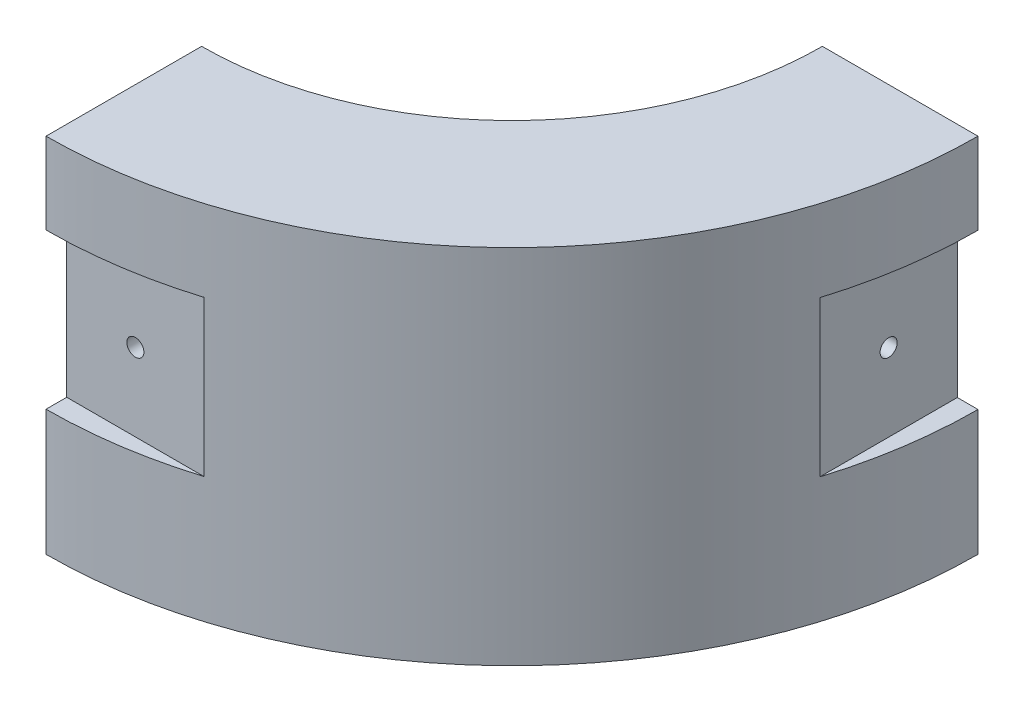
ISO-10303-21;
HEADER;
FILE_DESCRIPTION(('STEP AP214'),'2;1');
FILE_NAME('part.step','',(''),(''),'','','');
FILE_SCHEMA(('AUTOMOTIVE_DESIGN { 1 0 10303 214 1 1 1 1 }'));
ENDSEC;
DATA;
#1=APPLICATION_CONTEXT('core data for automotive mechanical design processes');
#2=APPLICATION_PROTOCOL_DEFINITION('international standard','automotive_design',2000,#1);
#3=PRODUCT_CONTEXT('',#1,'mechanical');
#4=PRODUCT('Part','Part','',(#3));
#5=PRODUCT_RELATED_PRODUCT_CATEGORY('part','',(#4));
#6=PRODUCT_DEFINITION_FORMATION('','',#4);
#7=PRODUCT_DEFINITION_CONTEXT('part definition',#1,'design');
#8=PRODUCT_DEFINITION('design','',#6,#7);
#9=PRODUCT_DEFINITION_SHAPE('','',#8);
#10=(LENGTH_UNIT() NAMED_UNIT(*) SI_UNIT(.MILLI.,.METRE.));
#11=(NAMED_UNIT(*) PLANE_ANGLE_UNIT() SI_UNIT($,.RADIAN.));
#12=(NAMED_UNIT(*) SI_UNIT($,.STERADIAN.) SOLID_ANGLE_UNIT());
#13=UNCERTAINTY_MEASURE_WITH_UNIT(LENGTH_MEASURE(1.E-05),#10,'distance_accuracy_value','');
#14=(GEOMETRIC_REPRESENTATION_CONTEXT(3) GLOBAL_UNCERTAINTY_ASSIGNED_CONTEXT((#13)) GLOBAL_UNIT_ASSIGNED_CONTEXT((#10,
#11,#12)) REPRESENTATION_CONTEXT('',''));
#15=CARTESIAN_POINT('',(0.,0.,0.));
#16=DIRECTION('',(0.,0.,1.));
#17=DIRECTION('',(1.,0.,0.));
#18=AXIS2_PLACEMENT_3D('',#15,#16,#17);
#19=CARTESIAN_POINT('',(0.,8.50000000000001,0.));
#20=DIRECTION('',(0.,1.,0.));
#21=DIRECTION('',(0.,0.,1.));
#22=AXIS2_PLACEMENT_3D('',#19,#20,#21);
#23=CYLINDRICAL_SURFACE('',#22,60.);
#24=CARTESIAN_POINT('',(14.9221512950991,39.294262642486,58.1147950243841));
#25=CARTESIAN_POINT('',(14.9221469227341,39.20366927716,58.1147963415276));
#26=CARTESIAN_POINT('',(14.9146611202311,39.1130088200521,58.1167198726083));
#27=CARTESIAN_POINT('',(14.8849458180313,38.9342275975515,58.1243375314419));
#28=CARTESIAN_POINT('',(14.8626983673999,38.8461100607909,58.1300362500063));
#29=CARTESIAN_POINT('',(14.8042287410592,38.6750745396955,58.1449543367766));
#30=CARTESIAN_POINT('',(14.7680232244369,38.5921504935091,58.1541695079292));
#31=CARTESIAN_POINT('',(14.6828059285463,38.433651738914,58.1757435076237));
#32=CARTESIAN_POINT('',(14.6337964510278,38.3580757129095,58.1881017711258));
#33=CARTESIAN_POINT('',(14.5236516849033,38.2151401531799,58.2156920613692));
#34=CARTESIAN_POINT('',(14.4623497471194,38.1479167477254,58.2309634246752));
#35=CARTESIAN_POINT('',(14.3298804772536,38.0246570988623,58.2637037438709));
#36=CARTESIAN_POINT('',(14.2587114917633,37.9686227342348,58.2811730680244));
#37=CARTESIAN_POINT('',(14.1062845273381,37.8676158198989,58.3182566273485));
#38=CARTESIAN_POINT('',(14.0247930282642,37.8230130942743,58.3379185236071));
#39=CARTESIAN_POINT('',(13.8557171254212,37.7481376120185,58.3783063706649));
#40=CARTESIAN_POINT('',(13.7681318901063,37.7178668155257,58.3990324665822));
#41=CARTESIAN_POINT('',(13.5871392985228,37.6718564292309,58.4414106274242));
#42=CARTESIAN_POINT('',(13.4936437536102,37.6564726065591,58.4630730134987));
#43=CARTESIAN_POINT('',(13.3053527215496,37.6418959913984,58.5062126469877));
#44=CARTESIAN_POINT('',(13.2105571553876,37.6427041874417,58.5276898830186));
#45=CARTESIAN_POINT('',(13.0216334004083,37.6606138688564,58.5700136774354));
#46=CARTESIAN_POINT('',(12.9275151266781,37.6778341853051,58.5908544912301));
#47=CARTESIAN_POINT('',(12.7433918975445,37.7283680196787,58.6311764268283));
#48=CARTESIAN_POINT('',(12.6533868079374,37.7616810121256,58.6506575930049));
#49=CARTESIAN_POINT('',(12.481040744964,37.8431798716201,58.687573824372));
#50=CARTESIAN_POINT('',(12.3986333848374,37.8912169889838,58.7050270485237));
#51=CARTESIAN_POINT('',(12.2430291193323,38.0010218305658,58.7376758709596));
#52=CARTESIAN_POINT('',(12.1698312545192,38.0627881226363,58.752871704446));
#53=CARTESIAN_POINT('',(12.0363202437684,38.1969922103927,58.7803671303909));
#54=CARTESIAN_POINT('',(11.9757795688528,38.2691930380173,58.7927183656587));
#55=CARTESIAN_POINT('',(11.8677069952935,38.4231274072478,58.8146289748668));
#56=CARTESIAN_POINT('',(11.8201735518948,38.5048598152257,58.8241886803418));
#57=CARTESIAN_POINT('',(11.7404967175674,38.6737215435126,58.8401424349808));
#58=CARTESIAN_POINT('',(11.7080568862058,38.7607052795946,58.8465975525435));
#59=CARTESIAN_POINT('',(11.6581859458773,38.9390364691719,58.8564979714378));
#60=CARTESIAN_POINT('',(11.6407534895034,39.0303835301376,58.8599435429759));
#61=CARTESIAN_POINT('',(11.6215974558441,39.2134751773462,58.8637287939288));
#62=CARTESIAN_POINT('',(11.6196573220399,39.3051962847018,58.8641112901842));
#63=CARTESIAN_POINT('',(11.6309770333057,39.4876560880097,58.8618756544593));
#64=CARTESIAN_POINT('',(11.6442362897513,39.5783948218688,58.8592576386794));
#65=CARTESIAN_POINT('',(11.6854526349536,39.7559582586201,58.8510886131485));
#66=CARTESIAN_POINT('',(11.7133528316064,39.8427967092135,58.8455489559623));
#67=CARTESIAN_POINT('',(11.7829467557496,40.0105122310484,58.8316531934488));
#68=CARTESIAN_POINT('',(11.8246407225153,40.0913891988486,58.8232970392646));
#69=CARTESIAN_POINT('',(11.9208830414033,40.2455174734254,58.803868620552));
#70=CARTESIAN_POINT('',(11.9755185046682,40.3187120270351,58.7927779277773));
#71=CARTESIAN_POINT('',(12.095840027087,40.4548870974369,58.7681411671393));
#72=CARTESIAN_POINT('',(12.1615268480136,40.5178669095363,58.7545949300099));
#73=CARTESIAN_POINT('',(12.3031679000296,40.6329294990786,58.7250999617933));
#74=CARTESIAN_POINT('',(12.3792698799385,40.6848213485332,58.7091161896505));
#75=CARTESIAN_POINT('',(12.5387064226015,40.7751256760321,58.6752714306264));
#76=CARTESIAN_POINT('',(12.6220417287431,40.8135367665732,58.6574102507592));
#77=CARTESIAN_POINT('',(12.7954158213242,40.8766370863894,58.6198375626129));
#78=CARTESIAN_POINT('',(12.8855581553356,40.9010234799505,58.6000952369927));
#79=CARTESIAN_POINT('',(13.0684377629781,40.9342752855267,58.5595825360044));
#80=CARTESIAN_POINT('',(13.1611753284177,40.9431389449806,58.5388120448256));
#81=CARTESIAN_POINT('',(13.3484294405114,40.9452043573767,58.4963999981371));
#82=CARTESIAN_POINT('',(13.4429472530337,40.9381142454552,58.4747494425681));
#83=CARTESIAN_POINT('',(13.6294148519335,40.9078875396702,58.4315686504179));
#84=CARTESIAN_POINT('',(13.7213644551371,40.8847498042572,58.4100384225062));
#85=CARTESIAN_POINT('',(13.9007547915968,40.822799638105,58.3676072499662));
#86=CARTESIAN_POINT('',(13.9881588456553,40.7838770014833,58.34671186358));
#87=CARTESIAN_POINT('',(14.1551972677514,40.6913467142423,58.3064128552911));
#88=CARTESIAN_POINT('',(14.2348321408089,40.6377400189944,58.2870091364432));
#89=CARTESIAN_POINT('',(14.3831078859067,40.5178904143948,58.2505964210447));
#90=CARTESIAN_POINT('',(14.4518581600086,40.4517901625983,58.2335638342311));
#91=CARTESIAN_POINT('',(14.5772300959874,40.308333656656,58.2023070777395));
#92=CARTESIAN_POINT('',(14.6338504115633,40.2309761546695,58.1880832198152));
#93=CARTESIAN_POINT('',(14.7317612970982,40.0693378496541,58.1633707900868));
#94=CARTESIAN_POINT('',(14.7734084458789,39.9852860706452,58.1527956157795));
#95=CARTESIAN_POINT('',(14.8419064400417,39.8110817283934,58.1353513480275));
#96=CARTESIAN_POINT('',(14.8687788610583,39.7209382781909,58.1284768507676));
#97=CARTESIAN_POINT('',(14.8992143820497,39.5741398160179,58.1206808071867));
#98=CARTESIAN_POINT('',(14.9078030980745,39.5185442845863,58.118477630991));
#99=CARTESIAN_POINT('',(14.9192728640758,39.4067286632114,58.1155343429708));
#100=CARTESIAN_POINT('',(14.9221540097325,39.3505085837538,58.1147942066202));
#101=CARTESIAN_POINT('',(14.9221512950991,39.294262642486,58.1147950243841));
#102=B_SPLINE_CURVE_WITH_KNOTS('',3,(#24,#25,#26,#27,#28,#29,#30,#31,#32,#33,#34,#35,#36,#37,
#38,#39,#40,#41,#42,#43,#44,#45,#46,#47,#48,#49,#50,#51,#52,#53,#54,#55,#56,#57,#58,#59,#60,#61,
#62,#63,#64,#65,#66,#67,#68,#69,#70,#71,#72,#73,#74,#75,#76,#77,#78,#79,#80,#81,#82,#83,#84,#85,
#86,#87,#88,#89,#90,#91,#92,#93,#94,#95,#96,#97,#98,#99,#100,#101),.UNSPECIFIED.,.T.,.F.,(4,2,2,
2,2,2,2,2,2,2,2,2,2,2,2,2,2,2,2,2,2,2,2,2,2,2,2,2,2,2,2,2,2,2,2,2,2,2,4),(0.,0.271571032905485,
0.543472917096381,0.815051283412162,1.08658086202719,1.36207627546562,1.63761790923504,
1.92118693759224,2.20479473770512,2.49502405308403,2.78527108718731,3.07763573263329,
3.3699908320754,3.65948469052134,3.94894836481111,4.23264851389158,4.51631495575284,
4.79414680886316,5.0719537147982,5.34587043019891,5.61977653802808,5.89262609165547,
6.16548037855031,6.44022627023306,6.71499110797864,6.99416181247026,7.27336124210412,
7.55838264927835,7.84343623411302,8.13374701584437,8.42407845098476,8.71647278914112,
9.00884810811023,9.29806717770489,9.58731833103738,9.86913569452448,10.1505404176964,
10.3191512688404,10.487759293411),.UNSPECIFIED.);
#103=CARTESIAN_POINT('',(14.9221512950991,39.294262642486,58.1147950243841));
#104=VERTEX_POINT('',#103);
#105=EDGE_CURVE('E140',#104,#104,#102,.T.);
#106=ORIENTED_EDGE('',*,*,#105,.F.);
#107=EDGE_LOOP('',(#106));
#108=FACE_BOUND('',#107,.T.);
#109=CARTESIAN_POINT('',(0.,70.,0.));
#110=DIRECTION('',(0.,-1.,0.));
#111=DIRECTION('',(0.,0.,1.));
#112=AXIS2_PLACEMENT_3D('',#109,#110,#111);
#113=CIRCLE('',#112,60.);
#114=CARTESIAN_POINT('',(60.,70.,0.));
#115=VERTEX_POINT('',#114);
#116=CARTESIAN_POINT('',(0.,70.,60.));
#117=VERTEX_POINT('',#116);
#118=EDGE_CURVE('E216',#115,#117,#113,.T.);
#119=ORIENTED_EDGE('',*,*,#118,.F.);
#120=DIRECTION('',(0.,1.,0.));
#121=VECTOR('',#120,1.);
#122=CARTESIAN_POINT('',(60.,8.50000000000001,0.));
#123=LINE('',#122,#121);
#124=CARTESIAN_POINT('',(60.,8.50000000000001,0.));
#125=VERTEX_POINT('',#124);
#126=EDGE_CURVE('E255',#125,#115,#123,.T.);
#127=ORIENTED_EDGE('',*,*,#126,.F.);
#128=CARTESIAN_POINT('',(0.,8.50000000000001,0.));
#129=DIRECTION('',(0.,-1.,0.));
#130=DIRECTION('',(0.,0.,1.));
#131=AXIS2_PLACEMENT_3D('',#128,#129,#130);
#132=CIRCLE('',#131,60.);
#133=CARTESIAN_POINT('',(0.,8.50000000000001,60.));
#134=VERTEX_POINT('',#133);
#135=EDGE_CURVE('E265',#125,#134,#132,.T.);
#136=ORIENTED_EDGE('',*,*,#135,.T.);
#137=DIRECTION('',(0.,1.,0.));
#138=VECTOR('',#137,1.);
#139=CARTESIAN_POINT('',(0.,8.50000000000001,60.));
#140=LINE('',#139,#138);
#141=EDGE_CURVE('E248',#134,#117,#140,.T.);
#142=ORIENTED_EDGE('',*,*,#141,.T.);
#143=EDGE_LOOP('',(#119,#127,#136,#142));
#144=FACE_BOUND('',#143,.T.);
#145=CARTESIAN_POINT('',(58.114795024384,39.25,14.9221512950991));
#146=CARTESIAN_POINT('',(58.1147963415276,39.159406634674,14.9221469227341));
#147=CARTESIAN_POINT('',(58.1167198726083,39.0687461775661,14.9146611202311));
#148=CARTESIAN_POINT('',(58.1243375314419,38.8899649550655,14.8849458180314));
#149=CARTESIAN_POINT('',(58.1300362500063,38.8018474183048,14.8626983674));
#150=CARTESIAN_POINT('',(58.1449543367766,38.6308118972094,14.8042287410593));
#151=CARTESIAN_POINT('',(58.1541695079292,38.5478878510231,14.7680232244369));
#152=CARTESIAN_POINT('',(58.1757435076237,38.389389096428,14.6828059285463));
#153=CARTESIAN_POINT('',(58.1881017711258,38.3138130704234,14.6337964510278));
#154=CARTESIAN_POINT('',(58.2156920613691,38.1708775106938,14.5236516849033));
#155=CARTESIAN_POINT('',(58.2309634246752,38.1036541052394,14.4623497471194));
#156=CARTESIAN_POINT('',(58.2637037438709,37.9803944563762,14.3298804772536));
#157=CARTESIAN_POINT('',(58.2811730680244,37.9243600917487,14.2587114917633));
#158=CARTESIAN_POINT('',(58.3182566273485,37.8233531774129,14.1062845273381));
#159=CARTESIAN_POINT('',(58.3379185236071,37.7787504517882,14.0247930282642));
#160=CARTESIAN_POINT('',(58.3783063706649,37.7038749695325,13.8557171254212));
#161=CARTESIAN_POINT('',(58.3990324665822,37.6736041730396,13.7681318901063));
#162=CARTESIAN_POINT('',(58.4414106274242,37.6275937867448,13.5871392985228));
#163=CARTESIAN_POINT('',(58.4630730134987,37.6122099640731,13.4936437536102));
#164=CARTESIAN_POINT('',(58.5062126469877,37.5976333489123,13.3053527215496));
#165=CARTESIAN_POINT('',(58.5276898830186,37.5984415449556,13.2105571553876));
#166=CARTESIAN_POINT('',(58.5700136774354,37.6163512263703,13.0216334004083));
#167=CARTESIAN_POINT('',(58.5908544912301,37.6335715428191,12.9275151266781));
#168=CARTESIAN_POINT('',(58.6311764268283,37.6841053771926,12.7433918975445));
#169=CARTESIAN_POINT('',(58.6506575930049,37.7174183696396,12.6533868079374));
#170=CARTESIAN_POINT('',(58.687573824372,37.7989172291341,12.4810407449641));
#171=CARTESIAN_POINT('',(58.7050270485237,37.8469543464978,12.3986333848374));
#172=CARTESIAN_POINT('',(58.7376758709595,37.9567591880797,12.2430291193324));
#173=CARTESIAN_POINT('',(58.752871704446,38.0185254801503,12.1698312545192));
#174=CARTESIAN_POINT('',(58.7803671303909,38.1527295679066,12.0363202437685));
#175=CARTESIAN_POINT('',(58.7927183656587,38.2249303955312,11.9757795688528));
#176=CARTESIAN_POINT('',(58.8146289748668,38.3788647647617,11.8677069952935));
#177=CARTESIAN_POINT('',(58.8241886803418,38.4605971727397,11.8201735518949));
#178=CARTESIAN_POINT('',(58.8401424349808,38.6294589010266,11.7404967175674));
#179=CARTESIAN_POINT('',(58.8465975525435,38.7164426371085,11.7080568862058));
#180=CARTESIAN_POINT('',(58.8564979714378,38.8947738266859,11.6581859458773));
#181=CARTESIAN_POINT('',(58.8599435429759,38.9861208876516,11.6407534895034));
#182=CARTESIAN_POINT('',(58.8637287939288,39.1692125348602,11.6215974558442));
#183=CARTESIAN_POINT('',(58.8641112901842,39.2609336422158,11.6196573220399));
#184=CARTESIAN_POINT('',(58.8618756544593,39.4433934455237,11.6309770333057));
#185=CARTESIAN_POINT('',(58.8592576386794,39.5341321793828,11.6442362897514));
#186=CARTESIAN_POINT('',(58.8510886131485,39.711695616134,11.6854526349536));
#187=CARTESIAN_POINT('',(58.8455489559623,39.7985340667274,11.7133528316064));
#188=CARTESIAN_POINT('',(58.8316531934488,39.9662495885624,11.7829467557496));
#189=CARTESIAN_POINT('',(58.8232970392646,40.0471265563625,11.8246407225153));
#190=CARTESIAN_POINT('',(58.803868620552,40.2012548309393,11.9208830414033));
#191=CARTESIAN_POINT('',(58.7927779277773,40.2744493845491,11.9755185046682));
#192=CARTESIAN_POINT('',(58.7681411671393,40.4106244549508,12.095840027087));
#193=CARTESIAN_POINT('',(58.7545949300099,40.4736042670503,12.1615268480136));
#194=CARTESIAN_POINT('',(58.7250999617933,40.5886668565925,12.3031679000296));
#195=CARTESIAN_POINT('',(58.7091161896505,40.6405587060472,12.3792698799385));
#196=CARTESIAN_POINT('',(58.6752714306264,40.7308630335461,12.5387064226015));
#197=CARTESIAN_POINT('',(58.6574102507592,40.7692741240871,12.6220417287431));
#198=CARTESIAN_POINT('',(58.6198375626129,40.8323744439034,12.7954158213242));
#199=CARTESIAN_POINT('',(58.6000952369927,40.8567608374645,12.8855581553356));
#200=CARTESIAN_POINT('',(58.5595825360044,40.8900126430407,13.0684377629781));
#201=CARTESIAN_POINT('',(58.5388120448256,40.8988763024945,13.1611753284177));
#202=CARTESIAN_POINT('',(58.4963999981371,40.9009417148906,13.3484294405114));
#203=CARTESIAN_POINT('',(58.4747494425681,40.8938516029691,13.4429472530337));
#204=CARTESIAN_POINT('',(58.4315686504179,40.8636248971841,13.6294148519335));
#205=CARTESIAN_POINT('',(58.4100384225062,40.8404871617711,13.7213644551371));
#206=CARTESIAN_POINT('',(58.3676072499662,40.778536995619,13.9007547915968));
#207=CARTESIAN_POINT('',(58.34671186358,40.7396143589972,13.9881588456553));
#208=CARTESIAN_POINT('',(58.3064128552911,40.6470840717562,14.1551972677514));
#209=CARTESIAN_POINT('',(58.2870091364432,40.5934773765083,14.2348321408089));
#210=CARTESIAN_POINT('',(58.2505964210447,40.4736277719087,14.3831078859067));
#211=CARTESIAN_POINT('',(58.2335638342311,40.4075275201122,14.4518581600086));
#212=CARTESIAN_POINT('',(58.2023070777395,40.26407101417,14.5772300959874));
#213=CARTESIAN_POINT('',(58.1880832198152,40.1867135121834,14.6338504115633));
#214=CARTESIAN_POINT('',(58.1633707900868,40.0250752071681,14.7317612970982));
#215=CARTESIAN_POINT('',(58.1527956157795,39.9410234281592,14.7734084458789));
#216=CARTESIAN_POINT('',(58.1353513480275,39.7668190859074,14.8419064400417));
#217=CARTESIAN_POINT('',(58.1284768507676,39.6766756357048,14.8687788610583));
#218=CARTESIAN_POINT('',(58.1206808071867,39.5298771735318,14.8992143820497));
#219=CARTESIAN_POINT('',(58.118477630991,39.4742816421002,14.9078030980745));
#220=CARTESIAN_POINT('',(58.1155343429708,39.3624660207254,14.9192728640758));
#221=CARTESIAN_POINT('',(58.1147942066202,39.3062459412677,14.9221540097325));
#222=CARTESIAN_POINT('',(58.114795024384,39.25,14.9221512950991));
#223=B_SPLINE_CURVE_WITH_KNOTS('',3,(#145,#146,#147,#148,#149,#150,#151,#152,#153,#154,#155,
#156,#157,#158,#159,#160,#161,#162,#163,#164,#165,#166,#167,#168,#169,#170,#171,#172,#173,#174,
#175,#176,#177,#178,#179,#180,#181,#182,#183,#184,#185,#186,#187,#188,#189,#190,#191,#192,#193,
#194,#195,#196,#197,#198,#199,#200,#201,#202,#203,#204,#205,#206,#207,#208,#209,#210,#211,#212,
#213,#214,#215,#216,#217,#218,#219,#220,#221,#222),.UNSPECIFIED.,.T.,.F.,(4,2,2,2,2,2,2,2,2,2,2,
2,2,2,2,2,2,2,2,2,2,2,2,2,2,2,2,2,2,2,2,2,2,2,2,2,2,2,4),(0.,0.271571032905485,
0.543472917096381,0.815051283412162,1.08658086202719,1.36207627546563,1.63761790923505,
1.92118693759224,2.20479473770512,2.49502405308403,2.78527108718731,3.07763573263329,
3.36999083207541,3.65948469052134,3.94894836481111,4.23264851389158,4.51631495575284,
4.79414680886317,5.0719537147982,5.34587043019891,5.61977653802808,5.89262609165547,
6.1654803785503,6.44022627023306,6.71499110797864,6.99416181247026,7.27336124210413,
7.55838264927835,7.84343623411302,8.13374701584437,8.42407845098476,8.71647278914113,
9.00884810811023,9.29806717770489,9.58731833103737,9.86913569452448,10.1505404176964,
10.3191512688404,10.487759293411),.UNSPECIFIED.);
#224=CARTESIAN_POINT('',(58.114795024384,39.25,14.9221512950991));
#225=VERTEX_POINT('',#224);
#226=EDGE_CURVE('E160',#225,#225,#223,.T.);
#227=ORIENTED_EDGE('',*,*,#226,.T.);
#228=EDGE_LOOP('',(#227));
#229=FACE_BOUND('',#228,.T.);
#230=ADVANCED_FACE('F33',(#108,#144,#229),#23,.F.);
#231=CARTESIAN_POINT('',(0.,70.,0.));
#232=DIRECTION('',(0.,-1.,0.));
#233=DIRECTION('',(0.,0.,-1.));
#234=AXIS2_PLACEMENT_3D('',#231,#232,#233);
#235=CYLINDRICAL_SURFACE('',#234,75.);
#236=CARTESIAN_POINT('',(0.,8.50000000000001,0.));
#237=DIRECTION('',(0.,1.,0.));
#238=DIRECTION('',(0.,0.,1.));
#239=AXIS2_PLACEMENT_3D('',#236,#237,#238);
#240=CIRCLE('',#239,75.);
#241=CARTESIAN_POINT('',(0.,8.50000000000001,75.));
#242=VERTEX_POINT('',#241);
#243=CARTESIAN_POINT('',(75.,8.50000000000001,0.));
#244=VERTEX_POINT('',#243);
#245=EDGE_CURVE('E261',#242,#244,#240,.T.);
#246=ORIENTED_EDGE('',*,*,#245,.T.);
#247=DIRECTION('',(0.,-1.,0.));
#248=VECTOR('',#247,1.);
#249=CARTESIAN_POINT('',(75.,70.,0.));
#250=LINE('',#249,#248);
#251=CARTESIAN_POINT('',(75.,0.,0.));
#252=VERTEX_POINT('',#251);
#253=EDGE_CURVE('E228',#244,#252,#250,.T.);
#254=ORIENTED_EDGE('',*,*,#253,.T.);
#255=CARTESIAN_POINT('',(0.,0.,0.));
#256=DIRECTION('',(0.,-1.,0.));
#257=DIRECTION('',(0.,0.,1.));
#258=AXIS2_PLACEMENT_3D('',#255,#256,#257);
#259=CIRCLE('',#258,75.);
#260=CARTESIAN_POINT('',(0.,0.,75.));
#261=VERTEX_POINT('',#260);
#262=EDGE_CURVE('E239',#252,#261,#259,.T.);
#263=ORIENTED_EDGE('',*,*,#262,.T.);
#264=DIRECTION('',(0.,-1.,0.));
#265=VECTOR('',#264,1.);
#266=CARTESIAN_POINT('',(0.,70.,75.));
#267=LINE('',#266,#265);
#268=EDGE_CURVE('E230',#242,#261,#267,.T.);
#269=ORIENTED_EDGE('',*,*,#268,.F.);
#270=EDGE_LOOP('',(#246,#254,#263,#269));
#271=FACE_BOUND('',#270,.T.);
#272=ADVANCED_FACE('F201',(#271),#235,.F.);
#273=CARTESIAN_POINT('',(0.,70.,0.));
#274=DIRECTION('',(0.,-1.,0.));
#275=DIRECTION('',(0.,0.,-1.));
#276=AXIS2_PLACEMENT_3D('',#273,#274,#275);
#277=CYLINDRICAL_SURFACE('',#276,90.075);
#278=DIRECTION('',(0.,-1.,0.));
#279=VECTOR('',#278,1.);
#280=CARTESIAN_POINT('',(26.5443025901981,70.,86.075));
#281=LINE('',#280,#279);
#282=CARTESIAN_POINT('',(26.5443025901981,54.294262642486,86.075));
#283=VERTEX_POINT('',#282);
#284=CARTESIAN_POINT('',(26.5443025901981,24.2942626424861,86.075));
#285=VERTEX_POINT('',#284);
#286=EDGE_CURVE('E130',#283,#285,#281,.T.);
#287=ORIENTED_EDGE('',*,*,#286,.T.);
#288=CARTESIAN_POINT('',(0.,24.2942626424861,0.));
#289=DIRECTION('',(0.,-1.,0.));
#290=DIRECTION('',(0.,0.,-1.));
#291=AXIS2_PLACEMENT_3D('',#288,#289,#290);
#292=CIRCLE('',#291,90.075);
#293=CARTESIAN_POINT('',(0.,24.2942626424861,90.075));
#294=VERTEX_POINT('',#293);
#295=EDGE_CURVE('E156',#285,#294,#292,.T.);
#296=ORIENTED_EDGE('',*,*,#295,.T.);
#297=DIRECTION('',(0.,-1.,0.));
#298=VECTOR('',#297,1.);
#299=CARTESIAN_POINT('',(0.,70.,90.075));
#300=LINE('',#299,#298);
#301=CARTESIAN_POINT('',(0.,0.,90.075));
#302=VERTEX_POINT('',#301);
#303=EDGE_CURVE('E234',#294,#302,#300,.T.);
#304=ORIENTED_EDGE('',*,*,#303,.T.);
#305=CARTESIAN_POINT('',(0.,0.,0.));
#306=DIRECTION('',(0.,1.,0.));
#307=DIRECTION('',(0.,0.,1.));
#308=AXIS2_PLACEMENT_3D('',#305,#306,#307);
#309=CIRCLE('',#308,90.075);
#310=CARTESIAN_POINT('',(90.075,0.,0.));
#311=VERTEX_POINT('',#310);
#312=EDGE_CURVE('E245',#302,#311,#309,.T.);
#313=ORIENTED_EDGE('',*,*,#312,.T.);
#314=DIRECTION('',(0.,-1.,0.));
#315=VECTOR('',#314,1.);
#316=CARTESIAN_POINT('',(90.075,70.,0.));
#317=LINE('',#316,#315);
#318=CARTESIAN_POINT('',(90.075,24.25,0.));
#319=VERTEX_POINT('',#318);
#320=EDGE_CURVE('E227',#319,#311,#317,.T.);
#321=ORIENTED_EDGE('',*,*,#320,.F.);
#322=CARTESIAN_POINT('',(0.,24.25,0.));
#323=DIRECTION('',(0.,-1.,0.));
#324=DIRECTION('',(1.,0.,0.));
#325=AXIS2_PLACEMENT_3D('',#322,#323,#324);
#326=CIRCLE('',#325,90.075);
#327=CARTESIAN_POINT('',(86.075,24.25,26.5443025901981));
#328=VERTEX_POINT('',#327);
#329=EDGE_CURVE('E275',#319,#328,#326,.T.);
#330=ORIENTED_EDGE('',*,*,#329,.T.);
#331=DIRECTION('',(0.,-1.,0.));
#332=VECTOR('',#331,1.);
#333=CARTESIAN_POINT('',(86.075,70.,26.5443025901981));
#334=LINE('',#333,#332);
#335=CARTESIAN_POINT('',(86.075,54.25,26.5443025901981));
#336=VERTEX_POINT('',#335);
#337=EDGE_CURVE('E262',#328,#336,#334,.F.);
#338=ORIENTED_EDGE('',*,*,#337,.T.);
#339=CARTESIAN_POINT('',(0.,54.25,0.));
#340=DIRECTION('',(0.,1.,0.));
#341=DIRECTION('',(0.,0.,1.));
#342=AXIS2_PLACEMENT_3D('',#339,#340,#341);
#343=CIRCLE('',#342,90.075);
#344=CARTESIAN_POINT('',(90.075,54.25,0.));
#345=VERTEX_POINT('',#344);
#346=EDGE_CURVE('E278',#336,#345,#343,.T.);
#347=ORIENTED_EDGE('',*,*,#346,.T.);
#348=CARTESIAN_POINT('',(90.075,70.,0.));
#349=VERTEX_POINT('',#348);
#350=EDGE_CURVE('E224',#349,#345,#317,.T.);
#351=ORIENTED_EDGE('',*,*,#350,.F.);
#352=CARTESIAN_POINT('',(0.,70.,0.));
#353=DIRECTION('',(0.,1.,0.));
#354=DIRECTION('',(0.,0.,1.));
#355=AXIS2_PLACEMENT_3D('',#352,#353,#354);
#356=CIRCLE('',#355,90.075);
#357=CARTESIAN_POINT('',(0.,70.,90.075));
#358=VERTEX_POINT('',#357);
#359=EDGE_CURVE('E238',#358,#349,#356,.T.);
#360=ORIENTED_EDGE('',*,*,#359,.F.);
#361=CARTESIAN_POINT('',(0.,54.294262642486,90.075));
#362=VERTEX_POINT('',#361);
#363=EDGE_CURVE('E232',#358,#362,#300,.T.);
#364=ORIENTED_EDGE('',*,*,#363,.T.);
#365=CARTESIAN_POINT('',(0.,54.294262642486,0.));
#366=DIRECTION('',(0.,1.,0.));
#367=DIRECTION('',(0.,0.,1.));
#368=AXIS2_PLACEMENT_3D('',#365,#366,#367);
#369=CIRCLE('',#368,90.075);
#370=EDGE_CURVE('E48',#362,#283,#369,.T.);
#371=ORIENTED_EDGE('',*,*,#370,.T.);
#372=EDGE_LOOP('',(#287,#296,#304,#313,#321,#330,#338,#347,#351,#360,#364,#371));
#373=FACE_BOUND('',#372,.T.);
#374=ADVANCED_FACE('F35',(#373),#277,.T.);
#375=CARTESIAN_POINT('',(75.,70.,0.));
#376=DIRECTION('',(0.,0.,1.));
#377=DIRECTION('',(1.,0.,0.));
#378=AXIS2_PLACEMENT_3D('',#375,#376,#377);
#379=PLANE('',#378);
#380=DIRECTION('',(0.,1.,0.));
#381=VECTOR('',#380,1.);
#382=CARTESIAN_POINT('',(86.075,24.25,0.));
#383=LINE('',#382,#381);
#384=CARTESIAN_POINT('',(86.075,24.25,0.));
#385=VERTEX_POINT('',#384);
#386=CARTESIAN_POINT('',(86.075,54.25,0.));
#387=VERTEX_POINT('',#386);
#388=EDGE_CURVE('E55',#385,#387,#383,.T.);
#389=ORIENTED_EDGE('',*,*,#388,.F.);
#390=DIRECTION('',(1.,0.,0.));
#391=VECTOR('',#390,1.);
#392=CARTESIAN_POINT('',(75.,24.25,0.));
#393=LINE('',#392,#391);
#394=EDGE_CURVE('E41',#385,#319,#393,.T.);
#395=ORIENTED_EDGE('',*,*,#394,.T.);
#396=ORIENTED_EDGE('',*,*,#320,.T.);
#397=DIRECTION('',(-1.,0.,0.));
#398=VECTOR('',#397,1.);
#399=CARTESIAN_POINT('',(75.,0.,0.));
#400=LINE('',#399,#398);
#401=EDGE_CURVE('E242',#311,#252,#400,.T.);
#402=ORIENTED_EDGE('',*,*,#401,.T.);
#403=ORIENTED_EDGE('',*,*,#253,.F.);
#404=DIRECTION('',(-1.,0.,0.));
#405=VECTOR('',#404,1.);
#406=CARTESIAN_POINT('',(75.,8.50000000000001,0.));
#407=LINE('',#406,#405);
#408=EDGE_CURVE('E268',#244,#125,#407,.T.);
#409=ORIENTED_EDGE('',*,*,#408,.T.);
#410=ORIENTED_EDGE('',*,*,#126,.T.);
#411=DIRECTION('',(-1.,0.,0.));
#412=VECTOR('',#411,1.);
#413=CARTESIAN_POINT('',(75.,70.,0.));
#414=LINE('',#413,#412);
#415=EDGE_CURVE('E251',#349,#115,#414,.T.);
#416=ORIENTED_EDGE('',*,*,#415,.F.);
#417=ORIENTED_EDGE('',*,*,#350,.T.);
#418=DIRECTION('',(1.,0.,0.));
#419=VECTOR('',#418,1.);
#420=CARTESIAN_POINT('',(94.075,54.25,0.));
#421=LINE('',#420,#419);
#422=EDGE_CURVE('E284',#387,#345,#421,.T.);
#423=ORIENTED_EDGE('',*,*,#422,.F.);
#424=EDGE_LOOP('',(#389,#395,#396,#402,#403,#409,#410,#416,#417,#423));
#425=FACE_BOUND('',#424,.T.);
#426=ADVANCED_FACE('F290',(#425),#379,.F.);
#427=CARTESIAN_POINT('',(0.,70.,75.));
#428=DIRECTION('',(1.,0.,0.));
#429=DIRECTION('',(0.,0.,-1.));
#430=AXIS2_PLACEMENT_3D('',#427,#428,#429);
#431=PLANE('',#430);
#432=ORIENTED_EDGE('',*,*,#303,.F.);
#433=DIRECTION('',(0.,0.,1.));
#434=VECTOR('',#433,1.);
#435=CARTESIAN_POINT('',(0.,24.2942626424861,86.075));
#436=LINE('',#435,#434);
#437=CARTESIAN_POINT('',(0.,24.2942626424861,86.075));
#438=VERTEX_POINT('',#437);
#439=EDGE_CURVE('E132',#438,#294,#436,.T.);
#440=ORIENTED_EDGE('',*,*,#439,.F.);
#441=DIRECTION('',(0.,-1.,0.));
#442=VECTOR('',#441,1.);
#443=CARTESIAN_POINT('',(0.,24.2942626424861,86.075));
#444=LINE('',#443,#442);
#445=CARTESIAN_POINT('',(0.,54.294262642486,86.075));
#446=VERTEX_POINT('',#445);
#447=EDGE_CURVE('E127',#446,#438,#444,.T.);
#448=ORIENTED_EDGE('',*,*,#447,.F.);
#449=DIRECTION('',(0.,0.,1.));
#450=VECTOR('',#449,1.);
#451=CARTESIAN_POINT('',(0.,54.294262642486,75.));
#452=LINE('',#451,#450);
#453=EDGE_CURVE('E11',#446,#362,#452,.T.);
#454=ORIENTED_EDGE('',*,*,#453,.T.);
#455=ORIENTED_EDGE('',*,*,#363,.F.);
#456=DIRECTION('',(0.,0.,1.));
#457=VECTOR('',#456,1.);
#458=CARTESIAN_POINT('',(0.,70.,75.));
#459=LINE('',#458,#457);
#460=EDGE_CURVE('E249',#117,#358,#459,.T.);
#461=ORIENTED_EDGE('',*,*,#460,.F.);
#462=ORIENTED_EDGE('',*,*,#141,.F.);
#463=DIRECTION('',(0.,0.,1.));
#464=VECTOR('',#463,1.);
#465=CARTESIAN_POINT('',(0.,8.50000000000001,75.));
#466=LINE('',#465,#464);
#467=EDGE_CURVE('E258',#134,#242,#466,.T.);
#468=ORIENTED_EDGE('',*,*,#467,.T.);
#469=ORIENTED_EDGE('',*,*,#268,.T.);
#470=DIRECTION('',(0.,0.,1.));
#471=VECTOR('',#470,1.);
#472=CARTESIAN_POINT('',(0.,0.,75.));
#473=LINE('',#472,#471);
#474=EDGE_CURVE('E235',#261,#302,#473,.T.);
#475=ORIENTED_EDGE('',*,*,#474,.T.);
#476=EDGE_LOOP('',(#432,#440,#448,#454,#455,#461,#462,#468,#469,#475));
#477=FACE_BOUND('',#476,.T.);
#478=ADVANCED_FACE('F139',(#477),#431,.F.);
#479=CARTESIAN_POINT('',(0.,70.,0.));
#480=DIRECTION('',(0.,1.,0.));
#481=DIRECTION('',(0.,0.,1.));
#482=AXIS2_PLACEMENT_3D('',#479,#480,#481);
#483=PLANE('',#482);
#484=ORIENTED_EDGE('',*,*,#359,.T.);
#485=ORIENTED_EDGE('',*,*,#415,.T.);
#486=ORIENTED_EDGE('',*,*,#118,.T.);
#487=ORIENTED_EDGE('',*,*,#460,.T.);
#488=EDGE_LOOP('',(#484,#485,#486,#487));
#489=FACE_BOUND('',#488,.T.);
#490=ADVANCED_FACE('F197',(#489),#483,.T.);
#491=CARTESIAN_POINT('',(0.,0.,0.));
#492=DIRECTION('',(0.,1.,0.));
#493=DIRECTION('',(0.,0.,1.));
#494=AXIS2_PLACEMENT_3D('',#491,#492,#493);
#495=PLANE('',#494);
#496=ORIENTED_EDGE('',*,*,#312,.F.);
#497=ORIENTED_EDGE('',*,*,#474,.F.);
#498=ORIENTED_EDGE('',*,*,#262,.F.);
#499=ORIENTED_EDGE('',*,*,#401,.F.);
#500=EDGE_LOOP('',(#496,#497,#498,#499));
#501=FACE_BOUND('',#500,.T.);
#502=ADVANCED_FACE('F192',(#501),#495,.F.);
#503=CARTESIAN_POINT('',(0.,8.50000000000001,0.));
#504=DIRECTION('',(0.,1.,0.));
#505=DIRECTION('',(0.,0.,1.));
#506=AXIS2_PLACEMENT_3D('',#503,#504,#505);
#507=PLANE('',#506);
#508=ORIENTED_EDGE('',*,*,#245,.F.);
#509=ORIENTED_EDGE('',*,*,#467,.F.);
#510=ORIENTED_EDGE('',*,*,#135,.F.);
#511=ORIENTED_EDGE('',*,*,#408,.F.);
#512=EDGE_LOOP('',(#508,#509,#510,#511));
#513=FACE_BOUND('',#512,.T.);
#514=ADVANCED_FACE('F189',(#513),#507,.F.);
#515=CARTESIAN_POINT('',(86.075,24.25,61.5));
#516=DIRECTION('',(-1.,0.,0.));
#517=DIRECTION('',(0.,0.,1.));
#518=AXIS2_PLACEMENT_3D('',#515,#516,#517);
#519=PLANE('',#518);
#520=CARTESIAN_POINT('',(86.075,39.25,13.2721512950991));
#521=DIRECTION('',(-1.,0.,0.));
#522=DIRECTION('',(0.,0.,1.));
#523=AXIS2_PLACEMENT_3D('',#520,#521,#522);
#524=CIRCLE('',#523,1.65);
#525=CARTESIAN_POINT('',(86.075,39.25,14.9221512950991));
#526=VERTEX_POINT('',#525);
#527=EDGE_CURVE('E159',#526,#526,#524,.F.);
#528=ORIENTED_EDGE('',*,*,#527,.F.);
#529=EDGE_LOOP('',(#528));
#530=FACE_BOUND('',#529,.T.);
#531=DIRECTION('',(0.,0.,-1.));
#532=VECTOR('',#531,1.);
#533=CARTESIAN_POINT('',(86.075,24.25,61.5));
#534=LINE('',#533,#532);
#535=EDGE_CURVE('E281',#328,#385,#534,.T.);
#536=ORIENTED_EDGE('',*,*,#535,.T.);
#537=ORIENTED_EDGE('',*,*,#388,.T.);
#538=DIRECTION('',(0.,0.,-1.));
#539=VECTOR('',#538,1.);
#540=CARTESIAN_POINT('',(86.075,54.25,61.5));
#541=LINE('',#540,#539);
#542=EDGE_CURVE('E282',#336,#387,#541,.T.);
#543=ORIENTED_EDGE('',*,*,#542,.F.);
#544=ORIENTED_EDGE('',*,*,#337,.F.);
#545=EDGE_LOOP('',(#536,#537,#543,#544));
#546=FACE_BOUND('',#545,.T.);
#547=ADVANCED_FACE('F183',(#530,#546),#519,.F.);
#548=CARTESIAN_POINT('',(94.075,24.25,61.5));
#549=DIRECTION('',(0.,-1.,0.));
#550=DIRECTION('',(1.,0.,0.));
#551=AXIS2_PLACEMENT_3D('',#548,#549,#550);
#552=PLANE('',#551);
#553=ORIENTED_EDGE('',*,*,#394,.F.);
#554=ORIENTED_EDGE('',*,*,#535,.F.);
#555=ORIENTED_EDGE('',*,*,#329,.F.);
#556=EDGE_LOOP('',(#553,#554,#555));
#557=FACE_BOUND('',#556,.T.);
#558=ADVANCED_FACE('F180',(#557),#552,.F.);
#559=CARTESIAN_POINT('',(94.075,54.25,61.5));
#560=DIRECTION('',(0.,1.,0.));
#561=DIRECTION('',(0.,0.,1.));
#562=AXIS2_PLACEMENT_3D('',#559,#560,#561);
#563=PLANE('',#562);
#564=ORIENTED_EDGE('',*,*,#542,.T.);
#565=ORIENTED_EDGE('',*,*,#422,.T.);
#566=ORIENTED_EDGE('',*,*,#346,.F.);
#567=EDGE_LOOP('',(#564,#565,#566));
#568=FACE_BOUND('',#567,.T.);
#569=ADVANCED_FACE('F177',(#568),#563,.F.);
#570=CARTESIAN_POINT('',(181.5,39.25,13.2721512950991));
#571=DIRECTION('',(-1.,0.,0.));
#572=DIRECTION('',(0.,0.,1.));
#573=AXIS2_PLACEMENT_3D('',#570,#571,#572);
#574=CYLINDRICAL_SURFACE('',#573,1.65);
#575=ORIENTED_EDGE('',*,*,#226,.F.);
#576=EDGE_LOOP('',(#575));
#577=FACE_BOUND('',#576,.T.);
#578=ORIENTED_EDGE('',*,*,#527,.T.);
#579=EDGE_LOOP('',(#578));
#580=FACE_BOUND('',#579,.T.);
#581=ADVANCED_FACE('F171',(#577,#580),#574,.F.);
#582=CARTESIAN_POINT('',(181.5,24.2942626424861,86.075));
#583=DIRECTION('',(0.,-1.,0.));
#584=DIRECTION('',(0.,0.,-1.));
#585=AXIS2_PLACEMENT_3D('',#582,#583,#584);
#586=PLANE('',#585);
#587=DIRECTION('',(-1.,0.,0.));
#588=VECTOR('',#587,1.);
#589=CARTESIAN_POINT('',(181.5,24.2942626424861,86.075));
#590=LINE('',#589,#588);
#591=EDGE_CURVE('E131',#285,#438,#590,.T.);
#592=ORIENTED_EDGE('',*,*,#591,.T.);
#593=ORIENTED_EDGE('',*,*,#439,.T.);
#594=ORIENTED_EDGE('',*,*,#295,.F.);
#595=EDGE_LOOP('',(#592,#593,#594));
#596=FACE_BOUND('',#595,.T.);
#597=ADVANCED_FACE('F176',(#596),#586,.F.);
#598=CARTESIAN_POINT('',(181.5,24.2942626424861,86.075));
#599=DIRECTION('',(0.,0.,-1.));
#600=DIRECTION('',(0.,1.,0.));
#601=AXIS2_PLACEMENT_3D('',#598,#599,#600);
#602=PLANE('',#601);
#603=CARTESIAN_POINT('',(13.2721512950991,39.294262642486,86.075));
#604=DIRECTION('',(0.,0.,1.));
#605=DIRECTION('',(1.,0.,0.));
#606=AXIS2_PLACEMENT_3D('',#603,#604,#605);
#607=CIRCLE('',#606,1.65);
#608=CARTESIAN_POINT('',(14.9221512950991,39.294262642486,86.075));
#609=VERTEX_POINT('',#608);
#610=EDGE_CURVE('E144',#609,#609,#607,.T.);
#611=ORIENTED_EDGE('',*,*,#610,.F.);
#612=EDGE_LOOP('',(#611));
#613=FACE_BOUND('',#612,.T.);
#614=DIRECTION('',(-1.,0.,0.));
#615=VECTOR('',#614,1.);
#616=CARTESIAN_POINT('',(181.5,54.294262642486,86.075));
#617=LINE('',#616,#615);
#618=EDGE_CURVE('E123',#283,#446,#617,.T.);
#619=ORIENTED_EDGE('',*,*,#618,.T.);
#620=ORIENTED_EDGE('',*,*,#447,.T.);
#621=ORIENTED_EDGE('',*,*,#591,.F.);
#622=ORIENTED_EDGE('',*,*,#286,.F.);
#623=EDGE_LOOP('',(#619,#620,#621,#622));
#624=FACE_BOUND('',#623,.T.);
#625=ADVANCED_FACE('F124',(#613,#624),#602,.F.);
#626=CARTESIAN_POINT('',(181.5,54.294262642486,86.075));
#627=DIRECTION('',(0.,1.,0.));
#628=DIRECTION('',(0.,0.,1.));
#629=AXIS2_PLACEMENT_3D('',#626,#627,#628);
#630=PLANE('',#629);
#631=ORIENTED_EDGE('',*,*,#453,.F.);
#632=ORIENTED_EDGE('',*,*,#618,.F.);
#633=ORIENTED_EDGE('',*,*,#370,.F.);
#634=EDGE_LOOP('',(#631,#632,#633));
#635=FACE_BOUND('',#634,.T.);
#636=ADVANCED_FACE('F134',(#635),#630,.F.);
#637=CARTESIAN_POINT('',(13.2721512950991,39.294262642486,-95.425));
#638=DIRECTION('',(0.,0.,1.));
#639=DIRECTION('',(1.,0.,0.));
#640=AXIS2_PLACEMENT_3D('',#637,#638,#639);
#641=CYLINDRICAL_SURFACE('',#640,1.65);
#642=ORIENTED_EDGE('',*,*,#105,.T.);
#643=EDGE_LOOP('',(#642));
#644=FACE_BOUND('',#643,.T.);
#645=ORIENTED_EDGE('',*,*,#610,.T.);
#646=EDGE_LOOP('',(#645));
#647=FACE_BOUND('',#646,.T.);
#648=ADVANCED_FACE('F308',(#644,#647),#641,.F.);
#649=CLOSED_SHELL('',(#230,#272,#374,#426,#478,#490,#502,#514,#547,#558,#569,#581,#597,#625,
#636,#648));
#650=MANIFOLD_SOLID_BREP('B2',#649);
#651=ADVANCED_BREP_SHAPE_REPRESENTATION('',(#18,#650),#14);
#652=SHAPE_DEFINITION_REPRESENTATION(#9,#651);
ENDSEC;
END-ISO-10303-21;
